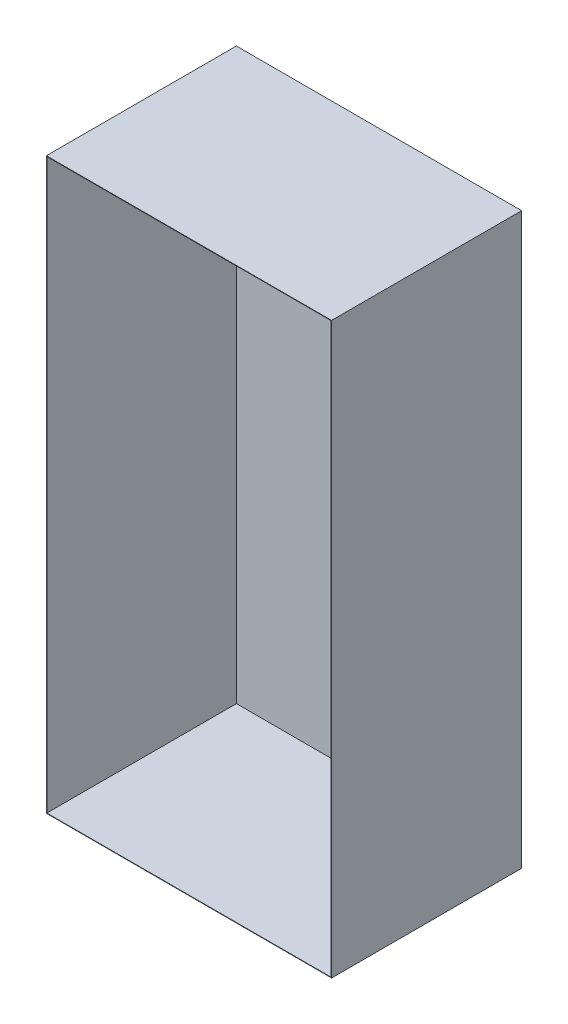
ISO-10303-21;
HEADER;
FILE_DESCRIPTION(('STEP AP214'),'2;1');
FILE_NAME('part.step','',(''),(''),'','','');
FILE_SCHEMA(('AUTOMOTIVE_DESIGN { 1 0 10303 214 1 1 1 1 }'));
ENDSEC;
DATA;
#1=APPLICATION_CONTEXT('core data for automotive mechanical design processes');
#2=APPLICATION_PROTOCOL_DEFINITION('international standard','automotive_design',2000,#1);
#3=PRODUCT_CONTEXT('',#1,'mechanical');
#4=PRODUCT('Part','Part','',(#3));
#5=PRODUCT_RELATED_PRODUCT_CATEGORY('part','',(#4));
#6=PRODUCT_DEFINITION_FORMATION('','',#4);
#7=PRODUCT_DEFINITION_CONTEXT('part definition',#1,'design');
#8=PRODUCT_DEFINITION('design','',#6,#7);
#9=PRODUCT_DEFINITION_SHAPE('','',#8);
#10=(LENGTH_UNIT() NAMED_UNIT(*) SI_UNIT(.MILLI.,.METRE.));
#11=(NAMED_UNIT(*) PLANE_ANGLE_UNIT() SI_UNIT($,.RADIAN.));
#12=(NAMED_UNIT(*) SI_UNIT($,.STERADIAN.) SOLID_ANGLE_UNIT());
#13=UNCERTAINTY_MEASURE_WITH_UNIT(LENGTH_MEASURE(1.E-05),#10,'distance_accuracy_value','');
#14=(GEOMETRIC_REPRESENTATION_CONTEXT(3) GLOBAL_UNCERTAINTY_ASSIGNED_CONTEXT((#13)) GLOBAL_UNIT_ASSIGNED_CONTEXT((#10,
#11,#12)) REPRESENTATION_CONTEXT('',''));
#15=CARTESIAN_POINT('',(0.,0.,0.));
#16=DIRECTION('',(0.,0.,1.));
#17=DIRECTION('',(1.,0.,0.));
#18=AXIS2_PLACEMENT_3D('',#15,#16,#17);
#19=CARTESIAN_POINT('',(76.454,-152.654,101.854));
#20=DIRECTION('',(-1.,0.,0.));
#21=DIRECTION('',(0.,0.,1.));
#22=AXIS2_PLACEMENT_3D('',#19,#20,#21);
#23=PLANE('',#22);
#24=DIRECTION('',(0.,1.,0.));
#25=VECTOR('',#24,1.);
#26=CARTESIAN_POINT('',(76.454,-152.654,0.));
#27=LINE('',#26,#25);
#28=CARTESIAN_POINT('',(76.454,-152.654,0.));
#29=VERTEX_POINT('',#28);
#30=CARTESIAN_POINT('',(76.454,152.654,0.));
#31=VERTEX_POINT('',#30);
#32=EDGE_CURVE('E141',#29,#31,#27,.T.);
#33=ORIENTED_EDGE('',*,*,#32,.T.);
#34=DIRECTION('',(0.,0.,-1.));
#35=VECTOR('',#34,1.);
#36=CARTESIAN_POINT('',(76.454,152.654,101.854));
#37=LINE('',#36,#35);
#38=CARTESIAN_POINT('',(76.454,152.654,101.854));
#39=VERTEX_POINT('',#38);
#40=EDGE_CURVE('E11',#39,#31,#37,.T.);
#41=ORIENTED_EDGE('',*,*,#40,.F.);
#42=DIRECTION('',(0.,1.,0.));
#43=VECTOR('',#42,1.);
#44=CARTESIAN_POINT('',(76.454,-152.654,101.854));
#45=LINE('',#44,#43);
#46=CARTESIAN_POINT('',(76.454,-152.654,101.854));
#47=VERTEX_POINT('',#46);
#48=EDGE_CURVE('E145',#47,#39,#45,.T.);
#49=ORIENTED_EDGE('',*,*,#48,.F.);
#50=DIRECTION('',(0.,0.,-1.));
#51=VECTOR('',#50,1.);
#52=CARTESIAN_POINT('',(76.454,-152.654,101.854));
#53=LINE('',#52,#51);
#54=EDGE_CURVE('E151',#47,#29,#53,.T.);
#55=ORIENTED_EDGE('',*,*,#54,.T.);
#56=EDGE_LOOP('',(#33,#41,#49,#55));
#57=FACE_BOUND('',#56,.T.);
#58=ADVANCED_FACE('F33',(#57),#23,.F.);
#59=CARTESIAN_POINT('',(-76.454,152.654,101.854));
#60=DIRECTION('',(0.,-1.,0.));
#61=DIRECTION('',(0.,0.,-1.));
#62=AXIS2_PLACEMENT_3D('',#59,#60,#61);
#63=PLANE('',#62);
#64=DIRECTION('',(-1.,0.,0.));
#65=VECTOR('',#64,1.);
#66=CARTESIAN_POINT('',(-76.454,152.654,0.));
#67=LINE('',#66,#65);
#68=CARTESIAN_POINT('',(-76.454,152.654,0.));
#69=VERTEX_POINT('',#68);
#70=EDGE_CURVE('E154',#31,#69,#67,.T.);
#71=ORIENTED_EDGE('',*,*,#70,.T.);
#72=DIRECTION('',(0.,0.,-1.));
#73=VECTOR('',#72,1.);
#74=CARTESIAN_POINT('',(-76.454,152.654,101.854));
#75=LINE('',#74,#73);
#76=CARTESIAN_POINT('',(-76.454,152.654,101.854));
#77=VERTEX_POINT('',#76);
#78=EDGE_CURVE('E40',#77,#69,#75,.T.);
#79=ORIENTED_EDGE('',*,*,#78,.F.);
#80=DIRECTION('',(-1.,0.,0.));
#81=VECTOR('',#80,1.);
#82=CARTESIAN_POINT('',(-76.454,152.654,101.854));
#83=LINE('',#82,#81);
#84=EDGE_CURVE('E84',#39,#77,#83,.T.);
#85=ORIENTED_EDGE('',*,*,#84,.F.);
#86=ORIENTED_EDGE('',*,*,#40,.T.);
#87=EDGE_LOOP('',(#71,#79,#85,#86));
#88=FACE_BOUND('',#87,.T.);
#89=ADVANCED_FACE('F183',(#88),#63,.F.);
#90=CARTESIAN_POINT('',(-76.454,-152.654,101.854));
#91=DIRECTION('',(1.,0.,0.));
#92=DIRECTION('',(0.,0.,-1.));
#93=AXIS2_PLACEMENT_3D('',#90,#91,#92);
#94=PLANE('',#93);
#95=DIRECTION('',(0.,-1.,0.));
#96=VECTOR('',#95,1.);
#97=CARTESIAN_POINT('',(-76.454,-152.654,0.));
#98=LINE('',#97,#96);
#99=CARTESIAN_POINT('',(-76.454,-152.654,0.));
#100=VERTEX_POINT('',#99);
#101=EDGE_CURVE('E156',#69,#100,#98,.T.);
#102=ORIENTED_EDGE('',*,*,#101,.T.);
#103=DIRECTION('',(0.,0.,-1.));
#104=VECTOR('',#103,1.);
#105=CARTESIAN_POINT('',(-76.454,-152.654,101.854));
#106=LINE('',#105,#104);
#107=CARTESIAN_POINT('',(-76.454,-152.654,101.854));
#108=VERTEX_POINT('',#107);
#109=EDGE_CURVE('E160',#108,#100,#106,.T.);
#110=ORIENTED_EDGE('',*,*,#109,.F.);
#111=DIRECTION('',(0.,-1.,0.));
#112=VECTOR('',#111,1.);
#113=CARTESIAN_POINT('',(-76.454,-152.654,101.854));
#114=LINE('',#113,#112);
#115=EDGE_CURVE('E148',#77,#108,#114,.T.);
#116=ORIENTED_EDGE('',*,*,#115,.F.);
#117=ORIENTED_EDGE('',*,*,#78,.T.);
#118=EDGE_LOOP('',(#102,#110,#116,#117));
#119=FACE_BOUND('',#118,.T.);
#120=ADVANCED_FACE('F165',(#119),#94,.F.);
#121=CARTESIAN_POINT('',(-76.454,-152.654,101.854));
#122=DIRECTION('',(0.,1.,0.));
#123=DIRECTION('',(0.,0.,1.));
#124=AXIS2_PLACEMENT_3D('',#121,#122,#123);
#125=PLANE('',#124);
#126=DIRECTION('',(1.,0.,0.));
#127=VECTOR('',#126,1.);
#128=CARTESIAN_POINT('',(-76.454,-152.654,0.));
#129=LINE('',#128,#127);
#130=EDGE_CURVE('E77',#100,#29,#129,.T.);
#131=ORIENTED_EDGE('',*,*,#130,.T.);
#132=ORIENTED_EDGE('',*,*,#54,.F.);
#133=DIRECTION('',(1.,0.,0.));
#134=VECTOR('',#133,1.);
#135=CARTESIAN_POINT('',(-76.454,-152.654,101.854));
#136=LINE('',#135,#134);
#137=EDGE_CURVE('E56',#108,#47,#136,.T.);
#138=ORIENTED_EDGE('',*,*,#137,.F.);
#139=ORIENTED_EDGE('',*,*,#109,.T.);
#140=EDGE_LOOP('',(#131,#132,#138,#139));
#141=FACE_BOUND('',#140,.T.);
#142=ADVANCED_FACE('F173',(#141),#125,.F.);
#143=CARTESIAN_POINT('',(0.,0.,101.854));
#144=DIRECTION('',(0.,0.,-1.));
#145=DIRECTION('',(-1.,0.,0.));
#146=AXIS2_PLACEMENT_3D('',#143,#144,#145);
#147=PLANE('',#146);
#148=DIRECTION('',(-1.,0.,0.));
#149=VECTOR('',#148,1.);
#150=CARTESIAN_POINT('',(-76.2,152.4,101.854));
#151=LINE('',#150,#149);
#152=CARTESIAN_POINT('',(76.2,152.4,101.854));
#153=VERTEX_POINT('',#152);
#154=CARTESIAN_POINT('',(-76.2,152.4,101.854));
#155=VERTEX_POINT('',#154);
#156=EDGE_CURVE('E135',#153,#155,#151,.T.);
#157=ORIENTED_EDGE('',*,*,#156,.F.);
#158=DIRECTION('',(0.,1.,0.));
#159=VECTOR('',#158,1.);
#160=CARTESIAN_POINT('',(76.2,-152.4,101.854));
#161=LINE('',#160,#159);
#162=CARTESIAN_POINT('',(76.2,-152.4,101.854));
#163=VERTEX_POINT('',#162);
#164=EDGE_CURVE('E47',#163,#153,#161,.T.);
#165=ORIENTED_EDGE('',*,*,#164,.F.);
#166=DIRECTION('',(1.,0.,0.));
#167=VECTOR('',#166,1.);
#168=CARTESIAN_POINT('',(-76.2,-152.4,101.854));
#169=LINE('',#168,#167);
#170=CARTESIAN_POINT('',(-76.2,-152.4,101.854));
#171=VERTEX_POINT('',#170);
#172=EDGE_CURVE('E126',#171,#163,#169,.T.);
#173=ORIENTED_EDGE('',*,*,#172,.F.);
#174=DIRECTION('',(0.,-1.,0.));
#175=VECTOR('',#174,1.);
#176=CARTESIAN_POINT('',(-76.2,-152.4,101.854));
#177=LINE('',#176,#175);
#178=EDGE_CURVE('E129',#155,#171,#177,.T.);
#179=ORIENTED_EDGE('',*,*,#178,.F.);
#180=EDGE_LOOP('',(#157,#165,#173,#179));
#181=FACE_BOUND('',#180,.T.);
#182=ORIENTED_EDGE('',*,*,#48,.T.);
#183=ORIENTED_EDGE('',*,*,#84,.T.);
#184=ORIENTED_EDGE('',*,*,#115,.T.);
#185=ORIENTED_EDGE('',*,*,#137,.T.);
#186=EDGE_LOOP('',(#182,#183,#184,#185));
#187=FACE_BOUND('',#186,.T.);
#188=ADVANCED_FACE('F175',(#181,#187),#147,.F.);
#189=CARTESIAN_POINT('',(0.,0.,0.));
#190=DIRECTION('',(0.,0.,-1.));
#191=DIRECTION('',(-1.,0.,0.));
#192=AXIS2_PLACEMENT_3D('',#189,#190,#191);
#193=PLANE('',#192);
#194=ORIENTED_EDGE('',*,*,#32,.F.);
#195=ORIENTED_EDGE('',*,*,#130,.F.);
#196=ORIENTED_EDGE('',*,*,#101,.F.);
#197=ORIENTED_EDGE('',*,*,#70,.F.);
#198=EDGE_LOOP('',(#194,#195,#196,#197));
#199=FACE_BOUND('',#198,.T.);
#200=ADVANCED_FACE('F169',(#199),#193,.T.);
#201=CARTESIAN_POINT('',(76.2,-152.4,0.25399999999999));
#202=DIRECTION('',(1.,0.,0.));
#203=DIRECTION('',(0.,0.,-1.));
#204=AXIS2_PLACEMENT_3D('',#201,#202,#203);
#205=PLANE('',#204);
#206=ORIENTED_EDGE('',*,*,#164,.T.);
#207=DIRECTION('',(0.,0.,1.));
#208=VECTOR('',#207,1.);
#209=CARTESIAN_POINT('',(76.2,152.4,0.25399999999999));
#210=LINE('',#209,#208);
#211=CARTESIAN_POINT('',(76.2,152.4,0.25399999999999));
#212=VERTEX_POINT('',#211);
#213=EDGE_CURVE('E104',#212,#153,#210,.T.);
#214=ORIENTED_EDGE('',*,*,#213,.F.);
#215=DIRECTION('',(0.,1.,0.));
#216=VECTOR('',#215,1.);
#217=CARTESIAN_POINT('',(76.2,-152.4,0.25399999999999));
#218=LINE('',#217,#216);
#219=CARTESIAN_POINT('',(76.2,-152.4,0.25399999999999));
#220=VERTEX_POINT('',#219);
#221=EDGE_CURVE('E108',#220,#212,#218,.T.);
#222=ORIENTED_EDGE('',*,*,#221,.F.);
#223=DIRECTION('',(0.,0.,1.));
#224=VECTOR('',#223,1.);
#225=CARTESIAN_POINT('',(76.2,-152.4,0.25399999999999));
#226=LINE('',#225,#224);
#227=EDGE_CURVE('E139',#220,#163,#226,.T.);
#228=ORIENTED_EDGE('',*,*,#227,.T.);
#229=EDGE_LOOP('',(#206,#214,#222,#228));
#230=FACE_BOUND('',#229,.T.);
#231=ADVANCED_FACE('F106',(#230),#205,.F.);
#232=CARTESIAN_POINT('',(-76.2,-152.4,0.25399999999999));
#233=DIRECTION('',(0.,-1.,0.));
#234=DIRECTION('',(0.,0.,-1.));
#235=AXIS2_PLACEMENT_3D('',#232,#233,#234);
#236=PLANE('',#235);
#237=ORIENTED_EDGE('',*,*,#172,.T.);
#238=ORIENTED_EDGE('',*,*,#227,.F.);
#239=DIRECTION('',(1.,0.,0.));
#240=VECTOR('',#239,1.);
#241=CARTESIAN_POINT('',(-76.2,-152.4,0.25399999999999));
#242=LINE('',#241,#240);
#243=CARTESIAN_POINT('',(-76.2,-152.4,0.25399999999999));
#244=VERTEX_POINT('',#243);
#245=EDGE_CURVE('E114',#244,#220,#242,.T.);
#246=ORIENTED_EDGE('',*,*,#245,.F.);
#247=DIRECTION('',(0.,0.,1.));
#248=VECTOR('',#247,1.);
#249=CARTESIAN_POINT('',(-76.2,-152.4,0.25399999999999));
#250=LINE('',#249,#248);
#251=EDGE_CURVE('E142',#244,#171,#250,.T.);
#252=ORIENTED_EDGE('',*,*,#251,.T.);
#253=EDGE_LOOP('',(#237,#238,#246,#252));
#254=FACE_BOUND('',#253,.T.);
#255=ADVANCED_FACE('F222',(#254),#236,.F.);
#256=CARTESIAN_POINT('',(-76.2,-152.4,0.25399999999999));
#257=DIRECTION('',(-1.,0.,0.));
#258=DIRECTION('',(0.,0.,1.));
#259=AXIS2_PLACEMENT_3D('',#256,#257,#258);
#260=PLANE('',#259);
#261=ORIENTED_EDGE('',*,*,#178,.T.);
#262=ORIENTED_EDGE('',*,*,#251,.F.);
#263=DIRECTION('',(0.,-1.,0.));
#264=VECTOR('',#263,1.);
#265=CARTESIAN_POINT('',(-76.2,-152.4,0.25399999999999));
#266=LINE('',#265,#264);
#267=CARTESIAN_POINT('',(-76.2,152.4,0.25399999999999));
#268=VERTEX_POINT('',#267);
#269=EDGE_CURVE('E122',#268,#244,#266,.T.);
#270=ORIENTED_EDGE('',*,*,#269,.F.);
#271=DIRECTION('',(0.,0.,1.));
#272=VECTOR('',#271,1.);
#273=CARTESIAN_POINT('',(-76.2,152.4,0.25399999999999));
#274=LINE('',#273,#272);
#275=EDGE_CURVE('E113',#268,#155,#274,.T.);
#276=ORIENTED_EDGE('',*,*,#275,.T.);
#277=EDGE_LOOP('',(#261,#262,#270,#276));
#278=FACE_BOUND('',#277,.T.);
#279=ADVANCED_FACE('F231',(#278),#260,.F.);
#280=CARTESIAN_POINT('',(-76.2,152.4,0.25399999999999));
#281=DIRECTION('',(0.,1.,0.));
#282=DIRECTION('',(0.,0.,1.));
#283=AXIS2_PLACEMENT_3D('',#280,#281,#282);
#284=PLANE('',#283);
#285=ORIENTED_EDGE('',*,*,#156,.T.);
#286=ORIENTED_EDGE('',*,*,#275,.F.);
#287=DIRECTION('',(-1.,0.,0.));
#288=VECTOR('',#287,1.);
#289=CARTESIAN_POINT('',(-76.2,152.4,0.25399999999999));
#290=LINE('',#289,#288);
#291=EDGE_CURVE('E117',#212,#268,#290,.T.);
#292=ORIENTED_EDGE('',*,*,#291,.F.);
#293=ORIENTED_EDGE('',*,*,#213,.T.);
#294=EDGE_LOOP('',(#285,#286,#292,#293));
#295=FACE_BOUND('',#294,.T.);
#296=ADVANCED_FACE('F118',(#295),#284,.F.);
#297=CARTESIAN_POINT('',(0.,0.,0.25399999999999));
#298=DIRECTION('',(0.,0.,-1.));
#299=DIRECTION('',(-1.,0.,0.));
#300=AXIS2_PLACEMENT_3D('',#297,#298,#299);
#301=PLANE('',#300);
#302=ORIENTED_EDGE('',*,*,#221,.T.);
#303=ORIENTED_EDGE('',*,*,#291,.T.);
#304=ORIENTED_EDGE('',*,*,#269,.T.);
#305=ORIENTED_EDGE('',*,*,#245,.T.);
#306=EDGE_LOOP('',(#302,#303,#304,#305));
#307=FACE_BOUND('',#306,.T.);
#308=ADVANCED_FACE('F124',(#307),#301,.F.);
#309=CLOSED_SHELL('',(#58,#89,#120,#142,#188,#200,#231,#255,#279,#296,#308));
#310=MANIFOLD_SOLID_BREP('B2',#309);
#311=ADVANCED_BREP_SHAPE_REPRESENTATION('',(#18,#310),#14);
#312=SHAPE_DEFINITION_REPRESENTATION(#9,#311);
ENDSEC;
END-ISO-10303-21;
